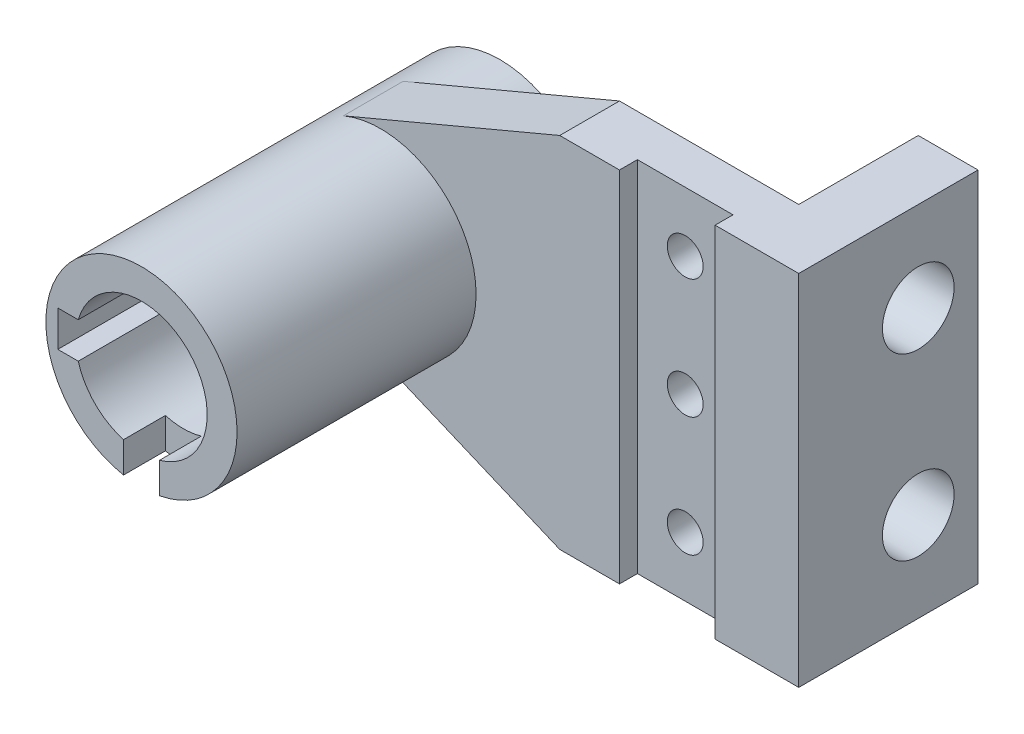
ISO-10303-21;
HEADER;
FILE_DESCRIPTION(('STEP AP214'),'2;1');
FILE_NAME('part.step','',(''),(''),'','','');
FILE_SCHEMA(('AUTOMOTIVE_DESIGN { 1 0 10303 214 1 1 1 1 }'));
ENDSEC;
DATA;
#1=APPLICATION_CONTEXT('core data for automotive mechanical design processes');
#2=APPLICATION_PROTOCOL_DEFINITION('international standard','automotive_design',2000,#1);
#3=PRODUCT_CONTEXT('',#1,'mechanical');
#4=PRODUCT('Part','Part','',(#3));
#5=PRODUCT_RELATED_PRODUCT_CATEGORY('part','',(#4));
#6=PRODUCT_DEFINITION_FORMATION('','',#4);
#7=PRODUCT_DEFINITION_CONTEXT('part definition',#1,'design');
#8=PRODUCT_DEFINITION('design','',#6,#7);
#9=PRODUCT_DEFINITION_SHAPE('','',#8);
#10=(LENGTH_UNIT() NAMED_UNIT(*) SI_UNIT(.MILLI.,.METRE.));
#11=(NAMED_UNIT(*) PLANE_ANGLE_UNIT() SI_UNIT($,.RADIAN.));
#12=(NAMED_UNIT(*) SI_UNIT($,.STERADIAN.) SOLID_ANGLE_UNIT());
#13=UNCERTAINTY_MEASURE_WITH_UNIT(LENGTH_MEASURE(1.E-05),#10,'distance_accuracy_value','');
#14=(GEOMETRIC_REPRESENTATION_CONTEXT(3) GLOBAL_UNCERTAINTY_ASSIGNED_CONTEXT((#13)) GLOBAL_UNIT_ASSIGNED_CONTEXT((#10,
#11,#12)) REPRESENTATION_CONTEXT('',''));
#15=CARTESIAN_POINT('',(0.,0.,0.));
#16=DIRECTION('',(0.,0.,1.));
#17=DIRECTION('',(1.,0.,0.));
#18=AXIS2_PLACEMENT_3D('',#15,#16,#17);
#19=CARTESIAN_POINT('',(0.,0.,-20.));
#20=DIRECTION('',(0.,0.,1.));
#21=DIRECTION('',(1.,0.,0.));
#22=AXIS2_PLACEMENT_3D('',#19,#20,#21);
#23=CYLINDRICAL_SURFACE('',#22,11.);
#24=DIRECTION('',(0.,0.,1.));
#25=VECTOR('',#24,1.);
#26=CARTESIAN_POINT('',(3.,-10.5830052442584,33.));
#27=LINE('',#26,#25);
#28=CARTESIAN_POINT('',(3.,-10.5830052442584,33.));
#29=VERTEX_POINT('',#28);
#30=CARTESIAN_POINT('',(3.,-10.5830052442584,40.));
#31=VERTEX_POINT('',#30);
#32=EDGE_CURVE('E193',#29,#31,#27,.T.);
#33=ORIENTED_EDGE('',*,*,#32,.T.);
#34=CARTESIAN_POINT('',(0.,0.,40.));
#35=DIRECTION('',(0.,0.,1.));
#36=DIRECTION('',(1.,0.,0.));
#37=AXIS2_PLACEMENT_3D('',#34,#35,#36);
#38=CIRCLE('',#37,11.);
#39=CARTESIAN_POINT('',(-10.5830052442584,3.,40.));
#40=VERTEX_POINT('',#39);
#41=EDGE_CURVE('E305',#31,#40,#38,.T.);
#42=ORIENTED_EDGE('',*,*,#41,.T.);
#43=DIRECTION('',(0.,0.,1.));
#44=VECTOR('',#43,1.);
#45=CARTESIAN_POINT('',(-10.5830052442584,3.,-20.));
#46=LINE('',#45,#44);
#47=CARTESIAN_POINT('',(-10.5830052442584,3.,-20.));
#48=VERTEX_POINT('',#47);
#49=EDGE_CURVE('E246',#48,#40,#46,.T.);
#50=ORIENTED_EDGE('',*,*,#49,.F.);
#51=CARTESIAN_POINT('',(0.,0.,-20.));
#52=DIRECTION('',(0.,0.,1.));
#53=DIRECTION('',(1.,0.,0.));
#54=AXIS2_PLACEMENT_3D('',#51,#52,#53);
#55=CIRCLE('',#54,11.);
#56=CARTESIAN_POINT('',(-10.5830052442584,-3.,-20.));
#57=VERTEX_POINT('',#56);
#58=EDGE_CURVE('E317',#57,#48,#55,.T.);
#59=ORIENTED_EDGE('',*,*,#58,.F.);
#60=DIRECTION('',(0.,0.,1.));
#61=VECTOR('',#60,1.);
#62=CARTESIAN_POINT('',(-10.5830052442584,-3.,-20.));
#63=LINE('',#62,#61);
#64=CARTESIAN_POINT('',(-10.5830052442584,-3.,40.));
#65=VERTEX_POINT('',#64);
#66=EDGE_CURVE('E326',#57,#65,#63,.T.);
#67=ORIENTED_EDGE('',*,*,#66,.T.);
#68=CARTESIAN_POINT('',(-3.,-10.5830052442584,40.));
#69=VERTEX_POINT('',#68);
#70=EDGE_CURVE('E306',#65,#69,#38,.T.);
#71=ORIENTED_EDGE('',*,*,#70,.T.);
#72=DIRECTION('',(0.,0.,1.));
#73=VECTOR('',#72,1.);
#74=CARTESIAN_POINT('',(-3.,-10.5830052442584,33.));
#75=LINE('',#74,#73);
#76=CARTESIAN_POINT('',(-3.,-10.5830052442584,33.));
#77=VERTEX_POINT('',#76);
#78=EDGE_CURVE('E58',#77,#69,#75,.T.);
#79=ORIENTED_EDGE('',*,*,#78,.F.);
#80=CARTESIAN_POINT('',(0.,0.,33.));
#81=DIRECTION('',(0.,0.,1.));
#82=DIRECTION('',(1.,0.,0.));
#83=AXIS2_PLACEMENT_3D('',#80,#81,#82);
#84=CIRCLE('',#83,11.);
#85=EDGE_CURVE('E209',#29,#77,#84,.F.);
#86=ORIENTED_EDGE('',*,*,#85,.F.);
#87=EDGE_LOOP('',(#33,#42,#50,#59,#67,#71,#79,#86));
#88=FACE_BOUND('',#87,.T.);
#89=ADVANCED_FACE('F41',(#88),#23,.F.);
#90=CARTESIAN_POINT('',(0.,0.,-20.));
#91=DIRECTION('',(0.,0.,1.));
#92=DIRECTION('',(1.,0.,0.));
#93=AXIS2_PLACEMENT_3D('',#90,#91,#92);
#94=CYLINDRICAL_SURFACE('',#93,16.);
#95=DIRECTION('',(0.,0.,1.));
#96=VECTOR('',#95,1.);
#97=CARTESIAN_POINT('',(-6.21167077567387,14.7450041090072,-10.));
#98=LINE('',#97,#96);
#99=CARTESIAN_POINT('',(-6.21167077567387,14.7450041090072,-10.));
#100=VERTEX_POINT('',#99);
#101=CARTESIAN_POINT('',(-6.21167077567387,14.7450041090072,0.));
#102=VERTEX_POINT('',#101);
#103=EDGE_CURVE('E274',#100,#102,#98,.T.);
#104=ORIENTED_EDGE('',*,*,#103,.F.);
#105=CARTESIAN_POINT('',(0.,0.,-10.));
#106=DIRECTION('',(0.,0.,1.));
#107=DIRECTION('',(1.,0.,0.));
#108=AXIS2_PLACEMENT_3D('',#105,#106,#107);
#109=CIRCLE('',#108,16.);
#110=CARTESIAN_POINT('',(-6.21167077567387,-14.7450041090072,-10.));
#111=VERTEX_POINT('',#110);
#112=EDGE_CURVE('E349',#111,#100,#109,.T.);
#113=ORIENTED_EDGE('',*,*,#112,.F.);
#114=DIRECTION('',(0.,0.,1.));
#115=VECTOR('',#114,1.);
#116=CARTESIAN_POINT('',(-6.21167077567387,-14.7450041090072,-10.));
#117=LINE('',#116,#115);
#118=CARTESIAN_POINT('',(-6.21167077567387,-14.7450041090072,0.));
#119=VERTEX_POINT('',#118);
#120=EDGE_CURVE('E45',#111,#119,#117,.T.);
#121=ORIENTED_EDGE('',*,*,#120,.T.);
#122=CARTESIAN_POINT('',(0.,0.,0.));
#123=DIRECTION('',(0.,0.,1.));
#124=DIRECTION('',(1.,0.,0.));
#125=AXIS2_PLACEMENT_3D('',#122,#123,#124);
#126=CIRCLE('',#125,16.);
#127=EDGE_CURVE('E347',#119,#102,#126,.T.);
#128=ORIENTED_EDGE('',*,*,#127,.T.);
#129=EDGE_LOOP('',(#104,#113,#121,#128));
#130=FACE_BOUND('',#129,.T.);
#131=CARTESIAN_POINT('',(0.,0.,-20.));
#132=DIRECTION('',(0.,0.,1.));
#133=DIRECTION('',(1.,0.,0.));
#134=AXIS2_PLACEMENT_3D('',#131,#132,#133);
#135=CIRCLE('',#134,16.);
#136=CARTESIAN_POINT('',(16.,0.,-20.));
#137=VERTEX_POINT('',#136);
#138=EDGE_CURVE('E323',#137,#137,#135,.T.);
#139=ORIENTED_EDGE('',*,*,#138,.T.);
#140=EDGE_LOOP('',(#139));
#141=FACE_BOUND('',#140,.T.);
#142=CARTESIAN_POINT('',(0.,0.,40.));
#143=DIRECTION('',(0.,0.,1.));
#144=DIRECTION('',(1.,0.,0.));
#145=AXIS2_PLACEMENT_3D('',#142,#143,#144);
#146=CIRCLE('',#145,16.);
#147=CARTESIAN_POINT('',(3.,-15.7162336455017,40.));
#148=VERTEX_POINT('',#147);
#149=CARTESIAN_POINT('',(-3.,-15.7162336455017,40.));
#150=VERTEX_POINT('',#149);
#151=EDGE_CURVE('E314',#148,#150,#146,.T.);
#152=ORIENTED_EDGE('',*,*,#151,.F.);
#153=DIRECTION('',(0.,0.,1.));
#154=VECTOR('',#153,1.);
#155=CARTESIAN_POINT('',(3.,-15.7162336455017,33.));
#156=LINE('',#155,#154);
#157=CARTESIAN_POINT('',(3.,-15.7162336455017,33.));
#158=VERTEX_POINT('',#157);
#159=EDGE_CURVE('E222',#158,#148,#156,.T.);
#160=ORIENTED_EDGE('',*,*,#159,.F.);
#161=CARTESIAN_POINT('',(0.,0.,33.));
#162=DIRECTION('',(0.,0.,1.));
#163=DIRECTION('',(1.,0.,0.));
#164=AXIS2_PLACEMENT_3D('',#161,#162,#163);
#165=CIRCLE('',#164,16.);
#166=CARTESIAN_POINT('',(-3.,-15.7162336455017,33.));
#167=VERTEX_POINT('',#166);
#168=EDGE_CURVE('E203',#167,#158,#165,.T.);
#169=ORIENTED_EDGE('',*,*,#168,.F.);
#170=DIRECTION('',(0.,0.,1.));
#171=VECTOR('',#170,1.);
#172=CARTESIAN_POINT('',(-3.,-15.7162336455017,33.));
#173=LINE('',#172,#171);
#174=EDGE_CURVE('E225',#167,#150,#173,.T.);
#175=ORIENTED_EDGE('',*,*,#174,.T.);
#176=EDGE_LOOP('',(#152,#160,#169,#175));
#177=FACE_BOUND('',#176,.T.);
#178=ADVANCED_FACE('F442',(#130,#141,#177),#94,.T.);
#179=CARTESIAN_POINT('',(0.,0.,40.));
#180=DIRECTION('',(0.,0.,1.));
#181=DIRECTION('',(1.,0.,0.));
#182=AXIS2_PLACEMENT_3D('',#179,#180,#181);
#183=PLANE('',#182);
#184=ORIENTED_EDGE('',*,*,#41,.F.);
#185=DIRECTION('',(0.,-1.,0.));
#186=VECTOR('',#185,1.);
#187=CARTESIAN_POINT('',(3.,0.,40.));
#188=LINE('',#187,#186);
#189=EDGE_CURVE('E199',#31,#148,#188,.T.);
#190=ORIENTED_EDGE('',*,*,#189,.T.);
#191=ORIENTED_EDGE('',*,*,#151,.T.);
#192=DIRECTION('',(0.,1.,0.));
#193=VECTOR('',#192,1.);
#194=CARTESIAN_POINT('',(-3.,0.,40.));
#195=LINE('',#194,#193);
#196=EDGE_CURVE('E212',#150,#69,#195,.T.);
#197=ORIENTED_EDGE('',*,*,#196,.T.);
#198=ORIENTED_EDGE('',*,*,#70,.F.);
#199=DIRECTION('',(1.,0.,0.));
#200=VECTOR('',#199,1.);
#201=CARTESIAN_POINT('',(0.,-3.,40.));
#202=LINE('',#201,#200);
#203=CARTESIAN_POINT('',(-14.,-3.,40.));
#204=VERTEX_POINT('',#203);
#205=EDGE_CURVE('E308',#204,#65,#202,.T.);
#206=ORIENTED_EDGE('',*,*,#205,.F.);
#207=DIRECTION('',(0.,-1.,0.));
#208=VECTOR('',#207,1.);
#209=CARTESIAN_POINT('',(-14.,0.,40.));
#210=LINE('',#209,#208);
#211=CARTESIAN_POINT('',(-14.,3.,40.));
#212=VERTEX_POINT('',#211);
#213=EDGE_CURVE('E311',#212,#204,#210,.T.);
#214=ORIENTED_EDGE('',*,*,#213,.F.);
#215=DIRECTION('',(1.,0.,0.));
#216=VECTOR('',#215,1.);
#217=CARTESIAN_POINT('',(0.,3.,40.));
#218=LINE('',#217,#216);
#219=EDGE_CURVE('E240',#212,#40,#218,.T.);
#220=ORIENTED_EDGE('',*,*,#219,.T.);
#221=EDGE_LOOP('',(#184,#190,#191,#197,#198,#206,#214,#220));
#222=FACE_BOUND('',#221,.T.);
#223=ADVANCED_FACE('F447',(#222),#183,.T.);
#224=CARTESIAN_POINT('',(0.,0.,-10.));
#225=DIRECTION('',(0.,0.,1.));
#226=DIRECTION('',(1.,0.,0.));
#227=AXIS2_PLACEMENT_3D('',#224,#225,#226);
#228=PLANE('',#227);
#229=ORIENTED_EDGE('',*,*,#112,.T.);
#230=DIRECTION('',(0.92156275681295,0.388229423479617,0.));
#231=VECTOR('',#230,1.);
#232=CARTESIAN_POINT('',(-6.21167077567387,14.7450041090072,-10.));
#233=LINE('',#232,#231);
#234=CARTESIAN_POINT('',(30.,30.,-10.));
#235=VERTEX_POINT('',#234);
#236=EDGE_CURVE('E264',#100,#235,#233,.T.);
#237=ORIENTED_EDGE('',*,*,#236,.T.);
#238=DIRECTION('',(1.,0.,0.));
#239=VECTOR('',#238,1.);
#240=CARTESIAN_POINT('',(0.,30.,-10.));
#241=LINE('',#240,#239);
#242=CARTESIAN_POINT('',(60.,30.,-10.));
#243=VERTEX_POINT('',#242);
#244=EDGE_CURVE('E267',#235,#243,#241,.T.);
#245=ORIENTED_EDGE('',*,*,#244,.T.);
#246=DIRECTION('',(0.,1.,0.));
#247=VECTOR('',#246,1.);
#248=CARTESIAN_POINT('',(60.,0.,-10.));
#249=LINE('',#248,#247);
#250=CARTESIAN_POINT('',(60.,-30.,-10.));
#251=VERTEX_POINT('',#250);
#252=EDGE_CURVE('E294',#251,#243,#249,.T.);
#253=ORIENTED_EDGE('',*,*,#252,.F.);
#254=DIRECTION('',(1.,0.,0.));
#255=VECTOR('',#254,1.);
#256=CARTESIAN_POINT('',(0.,-30.,-10.));
#257=LINE('',#256,#255);
#258=CARTESIAN_POINT('',(30.,-30.,-10.));
#259=VERTEX_POINT('',#258);
#260=EDGE_CURVE('E354',#259,#251,#257,.T.);
#261=ORIENTED_EDGE('',*,*,#260,.F.);
#262=DIRECTION('',(0.92156275681295,-0.388229423479617,0.));
#263=VECTOR('',#262,1.);
#264=CARTESIAN_POINT('',(-6.21167077567387,-14.7450041090072,-10.));
#265=LINE('',#264,#263);
#266=EDGE_CURVE('E351',#111,#259,#265,.T.);
#267=ORIENTED_EDGE('',*,*,#266,.F.);
#268=EDGE_LOOP('',(#229,#237,#245,#253,#261,#267));
#269=FACE_BOUND('',#268,.T.);
#270=CARTESIAN_POINT('',(48.,-20.,-10.));
#271=DIRECTION('',(0.,0.,1.));
#272=DIRECTION('',(1.,0.,0.));
#273=AXIS2_PLACEMENT_3D('',#270,#271,#272);
#274=CIRCLE('',#273,3.);
#275=CARTESIAN_POINT('',(51.,-20.,-10.));
#276=VERTEX_POINT('',#275);
#277=EDGE_CURVE('E359',#276,#276,#274,.T.);
#278=ORIENTED_EDGE('',*,*,#277,.T.);
#279=EDGE_LOOP('',(#278));
#280=FACE_BOUND('',#279,.T.);
#281=CARTESIAN_POINT('',(48.,0.,-10.));
#282=DIRECTION('',(0.,0.,1.));
#283=DIRECTION('',(1.,0.,0.));
#284=AXIS2_PLACEMENT_3D('',#281,#282,#283);
#285=CIRCLE('',#284,3.);
#286=CARTESIAN_POINT('',(51.,0.,-10.));
#287=VERTEX_POINT('',#286);
#288=EDGE_CURVE('E356',#287,#287,#285,.T.);
#289=ORIENTED_EDGE('',*,*,#288,.T.);
#290=EDGE_LOOP('',(#289));
#291=FACE_BOUND('',#290,.T.);
#292=CARTESIAN_POINT('',(48.,20.,-10.));
#293=DIRECTION('',(0.,0.,-1.));
#294=DIRECTION('',(1.,0.,0.));
#295=AXIS2_PLACEMENT_3D('',#292,#293,#294);
#296=CIRCLE('',#295,3.);
#297=CARTESIAN_POINT('',(51.,20.,-10.));
#298=VERTEX_POINT('',#297);
#299=EDGE_CURVE('E271',#298,#298,#296,.T.);
#300=ORIENTED_EDGE('',*,*,#299,.F.);
#301=EDGE_LOOP('',(#300));
#302=FACE_BOUND('',#301,.T.);
#303=ADVANCED_FACE('F393',(#269,#280,#291,#302),#228,.F.);
#304=CARTESIAN_POINT('',(48.,0.,-10.));
#305=DIRECTION('',(0.,0.,1.));
#306=DIRECTION('',(1.,0.,0.));
#307=AXIS2_PLACEMENT_3D('',#304,#305,#306);
#308=CYLINDRICAL_SURFACE('',#307,3.);
#309=CARTESIAN_POINT('',(48.,0.,-3.));
#310=DIRECTION('',(0.,0.,1.));
#311=DIRECTION('',(1.,0.,0.));
#312=AXIS2_PLACEMENT_3D('',#309,#310,#311);
#313=CIRCLE('',#312,3.);
#314=CARTESIAN_POINT('',(51.,0.,-3.));
#315=VERTEX_POINT('',#314);
#316=EDGE_CURVE('E333',#315,#315,#313,.T.);
#317=ORIENTED_EDGE('',*,*,#316,.T.);
#318=EDGE_LOOP('',(#317));
#319=FACE_BOUND('',#318,.T.);
#320=ORIENTED_EDGE('',*,*,#288,.F.);
#321=EDGE_LOOP('',(#320));
#322=FACE_BOUND('',#321,.T.);
#323=ADVANCED_FACE('F461',(#319,#322),#308,.F.);
#324=CARTESIAN_POINT('',(48.,-20.,-10.));
#325=DIRECTION('',(0.,0.,1.));
#326=DIRECTION('',(1.,0.,0.));
#327=AXIS2_PLACEMENT_3D('',#324,#325,#326);
#328=CYLINDRICAL_SURFACE('',#327,3.);
#329=ORIENTED_EDGE('',*,*,#277,.F.);
#330=EDGE_LOOP('',(#329));
#331=FACE_BOUND('',#330,.T.);
#332=CARTESIAN_POINT('',(48.,-20.,-3.));
#333=DIRECTION('',(0.,0.,1.));
#334=DIRECTION('',(1.,0.,0.));
#335=AXIS2_PLACEMENT_3D('',#332,#333,#334);
#336=CIRCLE('',#335,3.);
#337=CARTESIAN_POINT('',(51.,-20.,-3.));
#338=VERTEX_POINT('',#337);
#339=EDGE_CURVE('E330',#338,#338,#336,.T.);
#340=ORIENTED_EDGE('',*,*,#339,.T.);
#341=EDGE_LOOP('',(#340));
#342=FACE_BOUND('',#341,.T.);
#343=ADVANCED_FACE('F438',(#331,#342),#328,.F.);
#344=CARTESIAN_POINT('',(0.,0.,0.));
#345=DIRECTION('',(0.,0.,1.));
#346=DIRECTION('',(1.,0.,0.));
#347=AXIS2_PLACEMENT_3D('',#344,#345,#346);
#348=PLANE('',#347);
#349=DIRECTION('',(1.,0.,0.));
#350=VECTOR('',#349,1.);
#351=CARTESIAN_POINT('',(0.,-30.,0.));
#352=LINE('',#351,#350);
#353=CARTESIAN_POINT('',(30.,-30.,0.));
#354=VERTEX_POINT('',#353);
#355=CARTESIAN_POINT('',(40.,-30.,0.));
#356=VERTEX_POINT('',#355);
#357=EDGE_CURVE('E367',#354,#356,#352,.T.);
#358=ORIENTED_EDGE('',*,*,#357,.T.);
#359=DIRECTION('',(0.,1.,0.));
#360=VECTOR('',#359,1.);
#361=CARTESIAN_POINT('',(40.,0.,0.));
#362=LINE('',#361,#360);
#363=CARTESIAN_POINT('',(40.,30.,0.));
#364=VERTEX_POINT('',#363);
#365=EDGE_CURVE('E96',#356,#364,#362,.T.);
#366=ORIENTED_EDGE('',*,*,#365,.T.);
#367=DIRECTION('',(1.,0.,0.));
#368=VECTOR('',#367,1.);
#369=CARTESIAN_POINT('',(0.,30.,0.));
#370=LINE('',#369,#368);
#371=CARTESIAN_POINT('',(30.,30.,0.));
#372=VERTEX_POINT('',#371);
#373=EDGE_CURVE('E268',#372,#364,#370,.T.);
#374=ORIENTED_EDGE('',*,*,#373,.F.);
#375=DIRECTION('',(0.92156275681295,0.388229423479617,0.));
#376=VECTOR('',#375,1.);
#377=CARTESIAN_POINT('',(-6.21167077567387,14.7450041090072,0.));
#378=LINE('',#377,#376);
#379=EDGE_CURVE('E262',#102,#372,#378,.T.);
#380=ORIENTED_EDGE('',*,*,#379,.F.);
#381=ORIENTED_EDGE('',*,*,#127,.F.);
#382=DIRECTION('',(0.92156275681295,-0.388229423479617,0.));
#383=VECTOR('',#382,1.);
#384=CARTESIAN_POINT('',(-6.21167077567387,-14.7450041090072,0.));
#385=LINE('',#384,#383);
#386=EDGE_CURVE('E363',#119,#354,#385,.T.);
#387=ORIENTED_EDGE('',*,*,#386,.T.);
#388=EDGE_LOOP('',(#358,#366,#374,#380,#381,#387));
#389=FACE_BOUND('',#388,.T.);
#390=ADVANCED_FACE('F404',(#389),#348,.T.);
#391=CARTESIAN_POINT('',(70.,0.,-10.));
#392=DIRECTION('',(1.,0.,0.));
#393=DIRECTION('',(0.,0.,-1.));
#394=AXIS2_PLACEMENT_3D('',#391,#392,#393);
#395=PLANE('',#394);
#396=DIRECTION('',(0.,1.,0.));
#397=VECTOR('',#396,1.);
#398=CARTESIAN_POINT('',(70.,0.,0.));
#399=LINE('',#398,#397);
#400=CARTESIAN_POINT('',(70.,-30.,0.));
#401=VERTEX_POINT('',#400);
#402=CARTESIAN_POINT('',(70.,30.,0.));
#403=VERTEX_POINT('',#402);
#404=EDGE_CURVE('E352',#401,#403,#399,.T.);
#405=ORIENTED_EDGE('',*,*,#404,.F.);
#406=DIRECTION('',(0.,0.,1.));
#407=VECTOR('',#406,1.);
#408=CARTESIAN_POINT('',(70.,-30.,-10.));
#409=LINE('',#408,#407);
#410=CARTESIAN_POINT('',(70.,-30.,-30.));
#411=VERTEX_POINT('',#410);
#412=EDGE_CURVE('E11',#411,#401,#409,.T.);
#413=ORIENTED_EDGE('',*,*,#412,.F.);
#414=DIRECTION('',(0.,1.,0.));
#415=VECTOR('',#414,1.);
#416=CARTESIAN_POINT('',(70.,0.,-30.));
#417=LINE('',#416,#415);
#418=CARTESIAN_POINT('',(70.,30.,-30.));
#419=VERTEX_POINT('',#418);
#420=EDGE_CURVE('E292',#411,#419,#417,.T.);
#421=ORIENTED_EDGE('',*,*,#420,.T.);
#422=DIRECTION('',(0.,0.,1.));
#423=VECTOR('',#422,1.);
#424=CARTESIAN_POINT('',(70.,30.,-10.));
#425=LINE('',#424,#423);
#426=EDGE_CURVE('E280',#419,#403,#425,.T.);
#427=ORIENTED_EDGE('',*,*,#426,.T.);
#428=EDGE_LOOP('',(#405,#413,#421,#427));
#429=FACE_BOUND('',#428,.T.);
#430=CARTESIAN_POINT('',(70.,-15.,-20.));
#431=DIRECTION('',(1.,0.,0.));
#432=DIRECTION('',(0.,0.,-1.));
#433=AXIS2_PLACEMENT_3D('',#430,#431,#432);
#434=CIRCLE('',#433,6.);
#435=CARTESIAN_POINT('',(70.,-15.,-26.));
#436=VERTEX_POINT('',#435);
#437=EDGE_CURVE('E283',#436,#436,#434,.T.);
#438=ORIENTED_EDGE('',*,*,#437,.F.);
#439=EDGE_LOOP('',(#438));
#440=FACE_BOUND('',#439,.T.);
#441=CARTESIAN_POINT('',(70.,15.,-20.));
#442=DIRECTION('',(-1.,0.,0.));
#443=DIRECTION('',(0.,0.,-1.));
#444=AXIS2_PLACEMENT_3D('',#441,#442,#443);
#445=CIRCLE('',#444,6.);
#446=CARTESIAN_POINT('',(70.,15.,-26.));
#447=VERTEX_POINT('',#446);
#448=EDGE_CURVE('E224',#447,#447,#445,.T.);
#449=ORIENTED_EDGE('',*,*,#448,.T.);
#450=EDGE_LOOP('',(#449));
#451=FACE_BOUND('',#450,.T.);
#452=ADVANCED_FACE('F382',(#429,#440,#451),#395,.T.);
#453=CARTESIAN_POINT('',(0.,-30.,-10.));
#454=DIRECTION('',(0.,-1.,0.));
#455=DIRECTION('',(1.,0.,0.));
#456=AXIS2_PLACEMENT_3D('',#453,#454,#455);
#457=PLANE('',#456);
#458=DIRECTION('',(0.,0.,1.));
#459=VECTOR('',#458,1.);
#460=CARTESIAN_POINT('',(56.,-30.,-3.));
#461=LINE('',#460,#459);
#462=CARTESIAN_POINT('',(56.,-30.,-3.));
#463=VERTEX_POINT('',#462);
#464=CARTESIAN_POINT('',(56.,-30.,0.));
#465=VERTEX_POINT('',#464);
#466=EDGE_CURVE('E345',#463,#465,#461,.T.);
#467=ORIENTED_EDGE('',*,*,#466,.F.);
#468=DIRECTION('',(1.,0.,0.));
#469=VECTOR('',#468,1.);
#470=CARTESIAN_POINT('',(0.,-30.,-3.));
#471=LINE('',#470,#469);
#472=CARTESIAN_POINT('',(40.,-30.,-3.));
#473=VERTEX_POINT('',#472);
#474=EDGE_CURVE('E339',#473,#463,#471,.T.);
#475=ORIENTED_EDGE('',*,*,#474,.F.);
#476=DIRECTION('',(0.,0.,1.));
#477=VECTOR('',#476,1.);
#478=CARTESIAN_POINT('',(40.,-30.,-3.));
#479=LINE('',#478,#477);
#480=EDGE_CURVE('E342',#473,#356,#479,.T.);
#481=ORIENTED_EDGE('',*,*,#480,.T.);
#482=ORIENTED_EDGE('',*,*,#357,.F.);
#483=DIRECTION('',(0.,0.,1.));
#484=VECTOR('',#483,1.);
#485=CARTESIAN_POINT('',(30.,-30.,-10.));
#486=LINE('',#485,#484);
#487=EDGE_CURVE('E50',#259,#354,#486,.T.);
#488=ORIENTED_EDGE('',*,*,#487,.F.);
#489=ORIENTED_EDGE('',*,*,#260,.T.);
#490=DIRECTION('',(0.,0.,-1.));
#491=VECTOR('',#490,1.);
#492=CARTESIAN_POINT('',(60.,-30.,0.));
#493=LINE('',#492,#491);
#494=CARTESIAN_POINT('',(60.,-30.,-30.));
#495=VERTEX_POINT('',#494);
#496=EDGE_CURVE('E296',#251,#495,#493,.T.);
#497=ORIENTED_EDGE('',*,*,#496,.T.);
#498=DIRECTION('',(1.,0.,0.));
#499=VECTOR('',#498,1.);
#500=CARTESIAN_POINT('',(60.,-30.,-30.));
#501=LINE('',#500,#499);
#502=EDGE_CURVE('E299',#495,#411,#501,.T.);
#503=ORIENTED_EDGE('',*,*,#502,.T.);
#504=ORIENTED_EDGE('',*,*,#412,.T.);
#505=EDGE_CURVE('E366',#465,#401,#352,.T.);
#506=ORIENTED_EDGE('',*,*,#505,.F.);
#507=EDGE_LOOP('',(#467,#475,#481,#482,#488,#489,#497,#503,#504,#506));
#508=FACE_BOUND('',#507,.T.);
#509=ADVANCED_FACE('F414',(#508),#457,.T.);
#510=CARTESIAN_POINT('',(-6.21167077567387,-14.7450041090072,-10.));
#511=DIRECTION('',(-0.388229423479617,-0.92156275681295,0.));
#512=DIRECTION('',(0.92156275681295,-0.388229423479617,0.));
#513=AXIS2_PLACEMENT_3D('',#510,#511,#512);
#514=PLANE('',#513);
#515=ORIENTED_EDGE('',*,*,#386,.F.);
#516=ORIENTED_EDGE('',*,*,#120,.F.);
#517=ORIENTED_EDGE('',*,*,#266,.T.);
#518=ORIENTED_EDGE('',*,*,#487,.T.);
#519=EDGE_LOOP('',(#515,#516,#517,#518));
#520=FACE_BOUND('',#519,.T.);
#521=ADVANCED_FACE('F43',(#520),#514,.T.);
#522=DIRECTION('',(0.,1.,0.));
#523=VECTOR('',#522,1.);
#524=CARTESIAN_POINT('',(56.,0.,0.));
#525=LINE('',#524,#523);
#526=CARTESIAN_POINT('',(56.,30.,0.));
#527=VERTEX_POINT('',#526);
#528=EDGE_CURVE('E334',#465,#527,#525,.T.);
#529=ORIENTED_EDGE('',*,*,#528,.F.);
#530=ORIENTED_EDGE('',*,*,#505,.T.);
#531=ORIENTED_EDGE('',*,*,#404,.T.);
#532=EDGE_CURVE('E277',#527,#403,#370,.T.);
#533=ORIENTED_EDGE('',*,*,#532,.F.);
#534=EDGE_LOOP('',(#529,#530,#531,#533));
#535=FACE_BOUND('',#534,.T.);
#536=ADVANCED_FACE('F375',(#535),#348,.T.);
#537=CARTESIAN_POINT('',(56.,0.,-3.));
#538=DIRECTION('',(1.,0.,0.));
#539=DIRECTION('',(0.,0.,-1.));
#540=AXIS2_PLACEMENT_3D('',#537,#538,#539);
#541=PLANE('',#540);
#542=ORIENTED_EDGE('',*,*,#528,.T.);
#543=DIRECTION('',(0.,0.,1.));
#544=VECTOR('',#543,1.);
#545=CARTESIAN_POINT('',(56.,30.,-3.));
#546=LINE('',#545,#544);
#547=CARTESIAN_POINT('',(56.,30.,-3.));
#548=VERTEX_POINT('',#547);
#549=EDGE_CURVE('E259',#548,#527,#546,.T.);
#550=ORIENTED_EDGE('',*,*,#549,.F.);
#551=DIRECTION('',(0.,1.,0.));
#552=VECTOR('',#551,1.);
#553=CARTESIAN_POINT('',(56.,0.,-3.));
#554=LINE('',#553,#552);
#555=EDGE_CURVE('E85',#463,#548,#554,.T.);
#556=ORIENTED_EDGE('',*,*,#555,.F.);
#557=ORIENTED_EDGE('',*,*,#466,.T.);
#558=EDGE_LOOP('',(#542,#550,#556,#557));
#559=FACE_BOUND('',#558,.T.);
#560=ADVANCED_FACE('F412',(#559),#541,.F.);
#561=CARTESIAN_POINT('',(40.,0.,-3.));
#562=DIRECTION('',(1.,0.,0.));
#563=DIRECTION('',(0.,0.,-1.));
#564=AXIS2_PLACEMENT_3D('',#561,#562,#563);
#565=PLANE('',#564);
#566=ORIENTED_EDGE('',*,*,#365,.F.);
#567=ORIENTED_EDGE('',*,*,#480,.F.);
#568=DIRECTION('',(0.,1.,0.));
#569=VECTOR('',#568,1.);
#570=CARTESIAN_POINT('',(40.,0.,-3.));
#571=LINE('',#570,#569);
#572=CARTESIAN_POINT('',(40.,30.,-3.));
#573=VERTEX_POINT('',#572);
#574=EDGE_CURVE('E337',#473,#573,#571,.T.);
#575=ORIENTED_EDGE('',*,*,#574,.T.);
#576=DIRECTION('',(0.,0.,1.));
#577=VECTOR('',#576,1.);
#578=CARTESIAN_POINT('',(40.,30.,-3.));
#579=LINE('',#578,#577);
#580=EDGE_CURVE('E258',#573,#364,#579,.T.);
#581=ORIENTED_EDGE('',*,*,#580,.T.);
#582=EDGE_LOOP('',(#566,#567,#575,#581));
#583=FACE_BOUND('',#582,.T.);
#584=ADVANCED_FACE('F405',(#583),#565,.T.);
#585=CARTESIAN_POINT('',(0.,0.,-3.));
#586=DIRECTION('',(0.,0.,1.));
#587=DIRECTION('',(1.,0.,0.));
#588=AXIS2_PLACEMENT_3D('',#585,#586,#587);
#589=PLANE('',#588);
#590=DIRECTION('',(1.,0.,0.));
#591=VECTOR('',#590,1.);
#592=CARTESIAN_POINT('',(0.,30.,-3.));
#593=LINE('',#592,#591);
#594=EDGE_CURVE('E255',#573,#548,#593,.T.);
#595=ORIENTED_EDGE('',*,*,#594,.F.);
#596=ORIENTED_EDGE('',*,*,#574,.F.);
#597=ORIENTED_EDGE('',*,*,#474,.T.);
#598=ORIENTED_EDGE('',*,*,#555,.T.);
#599=EDGE_LOOP('',(#595,#596,#597,#598));
#600=FACE_BOUND('',#599,.T.);
#601=ORIENTED_EDGE('',*,*,#339,.F.);
#602=EDGE_LOOP('',(#601));
#603=FACE_BOUND('',#602,.T.);
#604=ORIENTED_EDGE('',*,*,#316,.F.);
#605=EDGE_LOOP('',(#604));
#606=FACE_BOUND('',#605,.T.);
#607=CARTESIAN_POINT('',(48.,20.,-3.));
#608=DIRECTION('',(0.,0.,-1.));
#609=DIRECTION('',(1.,0.,0.));
#610=AXIS2_PLACEMENT_3D('',#607,#608,#609);
#611=CIRCLE('',#610,3.);
#612=CARTESIAN_POINT('',(51.,20.,-3.));
#613=VERTEX_POINT('',#612);
#614=EDGE_CURVE('E250',#613,#613,#611,.T.);
#615=ORIENTED_EDGE('',*,*,#614,.T.);
#616=EDGE_LOOP('',(#615));
#617=FACE_BOUND('',#616,.T.);
#618=ADVANCED_FACE('F410',(#600,#603,#606,#617),#589,.T.);
#619=CARTESIAN_POINT('',(-14.,0.,-20.));
#620=DIRECTION('',(-1.,0.,0.));
#621=DIRECTION('',(0.,0.,1.));
#622=AXIS2_PLACEMENT_3D('',#619,#620,#621);
#623=PLANE('',#622);
#624=DIRECTION('',(0.,-1.,0.));
#625=VECTOR('',#624,1.);
#626=CARTESIAN_POINT('',(-14.,0.,-20.));
#627=LINE('',#626,#625);
#628=CARTESIAN_POINT('',(-14.,3.,-20.));
#629=VERTEX_POINT('',#628);
#630=CARTESIAN_POINT('',(-14.,-3.,-20.));
#631=VERTEX_POINT('',#630);
#632=EDGE_CURVE('E321',#629,#631,#627,.T.);
#633=ORIENTED_EDGE('',*,*,#632,.F.);
#634=DIRECTION('',(0.,0.,1.));
#635=VECTOR('',#634,1.);
#636=CARTESIAN_POINT('',(-14.,3.,-20.));
#637=LINE('',#636,#635);
#638=EDGE_CURVE('E247',#629,#212,#637,.T.);
#639=ORIENTED_EDGE('',*,*,#638,.T.);
#640=ORIENTED_EDGE('',*,*,#213,.T.);
#641=DIRECTION('',(0.,0.,1.));
#642=VECTOR('',#641,1.);
#643=CARTESIAN_POINT('',(-14.,-3.,-20.));
#644=LINE('',#643,#642);
#645=EDGE_CURVE('E327',#631,#204,#644,.T.);
#646=ORIENTED_EDGE('',*,*,#645,.F.);
#647=EDGE_LOOP('',(#633,#639,#640,#646));
#648=FACE_BOUND('',#647,.T.);
#649=ADVANCED_FACE('F455',(#648),#623,.F.);
#650=CARTESIAN_POINT('',(0.,-3.,-20.));
#651=DIRECTION('',(0.,-1.,0.));
#652=DIRECTION('',(1.,0.,0.));
#653=AXIS2_PLACEMENT_3D('',#650,#651,#652);
#654=PLANE('',#653);
#655=ORIENTED_EDGE('',*,*,#645,.T.);
#656=ORIENTED_EDGE('',*,*,#205,.T.);
#657=ORIENTED_EDGE('',*,*,#66,.F.);
#658=DIRECTION('',(1.,0.,0.));
#659=VECTOR('',#658,1.);
#660=CARTESIAN_POINT('',(0.,-3.,-20.));
#661=LINE('',#660,#659);
#662=EDGE_CURVE('E319',#631,#57,#661,.T.);
#663=ORIENTED_EDGE('',*,*,#662,.F.);
#664=EDGE_LOOP('',(#655,#656,#657,#663));
#665=FACE_BOUND('',#664,.T.);
#666=ADVANCED_FACE('F451',(#665),#654,.F.);
#667=CARTESIAN_POINT('',(0.,0.,-20.));
#668=DIRECTION('',(0.,0.,1.));
#669=DIRECTION('',(1.,0.,0.));
#670=AXIS2_PLACEMENT_3D('',#667,#668,#669);
#671=PLANE('',#670);
#672=ORIENTED_EDGE('',*,*,#58,.T.);
#673=DIRECTION('',(1.,0.,0.));
#674=VECTOR('',#673,1.);
#675=CARTESIAN_POINT('',(0.,3.,-20.));
#676=LINE('',#675,#674);
#677=EDGE_CURVE('E243',#629,#48,#676,.T.);
#678=ORIENTED_EDGE('',*,*,#677,.F.);
#679=ORIENTED_EDGE('',*,*,#632,.T.);
#680=ORIENTED_EDGE('',*,*,#662,.T.);
#681=EDGE_LOOP('',(#672,#678,#679,#680));
#682=FACE_BOUND('',#681,.T.);
#683=ORIENTED_EDGE('',*,*,#138,.F.);
#684=EDGE_LOOP('',(#683));
#685=FACE_BOUND('',#684,.T.);
#686=ADVANCED_FACE('F491',(#682,#685),#671,.F.);
#687=CARTESIAN_POINT('',(60.,0.,-30.));
#688=DIRECTION('',(0.,0.,-1.));
#689=DIRECTION('',(-1.,0.,0.));
#690=AXIS2_PLACEMENT_3D('',#687,#688,#689);
#691=PLANE('',#690);
#692=ORIENTED_EDGE('',*,*,#420,.F.);
#693=ORIENTED_EDGE('',*,*,#502,.F.);
#694=DIRECTION('',(0.,1.,0.));
#695=VECTOR('',#694,1.);
#696=CARTESIAN_POINT('',(60.,0.,-30.));
#697=LINE('',#696,#695);
#698=CARTESIAN_POINT('',(60.,30.,-30.));
#699=VERTEX_POINT('',#698);
#700=EDGE_CURVE('E291',#495,#699,#697,.T.);
#701=ORIENTED_EDGE('',*,*,#700,.T.);
#702=DIRECTION('',(1.,0.,0.));
#703=VECTOR('',#702,1.);
#704=CARTESIAN_POINT('',(60.,30.,-30.));
#705=LINE('',#704,#703);
#706=EDGE_CURVE('E235',#699,#419,#705,.T.);
#707=ORIENTED_EDGE('',*,*,#706,.T.);
#708=EDGE_LOOP('',(#692,#693,#701,#707));
#709=FACE_BOUND('',#708,.T.);
#710=ADVANCED_FACE('F386',(#709),#691,.T.);
#711=CARTESIAN_POINT('',(60.,-15.,-20.));
#712=DIRECTION('',(1.,0.,0.));
#713=DIRECTION('',(0.,0.,-1.));
#714=AXIS2_PLACEMENT_3D('',#711,#712,#713);
#715=CYLINDRICAL_SURFACE('',#714,6.);
#716=CARTESIAN_POINT('',(60.,-15.,-20.));
#717=DIRECTION('',(1.,0.,0.));
#718=DIRECTION('',(0.,0.,-1.));
#719=AXIS2_PLACEMENT_3D('',#716,#717,#718);
#720=CIRCLE('',#719,6.);
#721=CARTESIAN_POINT('',(60.,-15.,-26.));
#722=VERTEX_POINT('',#721);
#723=EDGE_CURVE('E288',#722,#722,#720,.T.);
#724=ORIENTED_EDGE('',*,*,#723,.F.);
#725=EDGE_LOOP('',(#724));
#726=FACE_BOUND('',#725,.T.);
#727=ORIENTED_EDGE('',*,*,#437,.T.);
#728=EDGE_LOOP('',(#727));
#729=FACE_BOUND('',#728,.T.);
#730=ADVANCED_FACE('F419',(#726,#729),#715,.F.);
#731=CARTESIAN_POINT('',(60.,0.,0.));
#732=DIRECTION('',(1.,0.,0.));
#733=DIRECTION('',(0.,0.,-1.));
#734=AXIS2_PLACEMENT_3D('',#731,#732,#733);
#735=PLANE('',#734);
#736=ORIENTED_EDGE('',*,*,#723,.T.);
#737=EDGE_LOOP('',(#736));
#738=FACE_BOUND('',#737,.T.);
#739=ORIENTED_EDGE('',*,*,#700,.F.);
#740=ORIENTED_EDGE('',*,*,#496,.F.);
#741=ORIENTED_EDGE('',*,*,#252,.T.);
#742=DIRECTION('',(0.,0.,-1.));
#743=VECTOR('',#742,1.);
#744=CARTESIAN_POINT('',(60.,30.,0.));
#745=LINE('',#744,#743);
#746=EDGE_CURVE('E232',#243,#699,#745,.T.);
#747=ORIENTED_EDGE('',*,*,#746,.T.);
#748=EDGE_LOOP('',(#739,#740,#741,#747));
#749=FACE_BOUND('',#748,.T.);
#750=CARTESIAN_POINT('',(60.,15.,-20.));
#751=DIRECTION('',(-1.,0.,0.));
#752=DIRECTION('',(0.,0.,-1.));
#753=AXIS2_PLACEMENT_3D('',#750,#751,#752);
#754=CIRCLE('',#753,6.);
#755=CARTESIAN_POINT('',(60.,15.,-26.));
#756=VERTEX_POINT('',#755);
#757=EDGE_CURVE('E229',#756,#756,#754,.T.);
#758=ORIENTED_EDGE('',*,*,#757,.F.);
#759=EDGE_LOOP('',(#758));
#760=FACE_BOUND('',#759,.T.);
#761=ADVANCED_FACE('F415',(#738,#749,#760),#735,.F.);
#762=CARTESIAN_POINT('',(48.,20.,-10.));
#763=DIRECTION('',(0.,0.,1.));
#764=DIRECTION('',(1.,0.,0.));
#765=AXIS2_PLACEMENT_3D('',#762,#763,#764);
#766=CYLINDRICAL_SURFACE('',#765,3.);
#767=ORIENTED_EDGE('',*,*,#299,.T.);
#768=EDGE_LOOP('',(#767));
#769=FACE_BOUND('',#768,.T.);
#770=ORIENTED_EDGE('',*,*,#614,.F.);
#771=EDGE_LOOP('',(#770));
#772=FACE_BOUND('',#771,.T.);
#773=ADVANCED_FACE('F418',(#769,#772),#766,.F.);
#774=CARTESIAN_POINT('',(0.,30.,-10.));
#775=DIRECTION('',(0.,1.,0.));
#776=DIRECTION('',(1.,0.,0.));
#777=AXIS2_PLACEMENT_3D('',#774,#775,#776);
#778=PLANE('',#777);
#779=ORIENTED_EDGE('',*,*,#549,.T.);
#780=ORIENTED_EDGE('',*,*,#532,.T.);
#781=ORIENTED_EDGE('',*,*,#426,.F.);
#782=ORIENTED_EDGE('',*,*,#706,.F.);
#783=ORIENTED_EDGE('',*,*,#746,.F.);
#784=ORIENTED_EDGE('',*,*,#244,.F.);
#785=DIRECTION('',(0.,0.,1.));
#786=VECTOR('',#785,1.);
#787=CARTESIAN_POINT('',(30.,30.,-10.));
#788=LINE('',#787,#786);
#789=EDGE_CURVE('E284',#235,#372,#788,.T.);
#790=ORIENTED_EDGE('',*,*,#789,.T.);
#791=ORIENTED_EDGE('',*,*,#373,.T.);
#792=ORIENTED_EDGE('',*,*,#580,.F.);
#793=ORIENTED_EDGE('',*,*,#594,.T.);
#794=EDGE_LOOP('',(#779,#780,#781,#782,#783,#784,#790,#791,#792,#793));
#795=FACE_BOUND('',#794,.T.);
#796=ADVANCED_FACE('F380',(#795),#778,.T.);
#797=CARTESIAN_POINT('',(-6.21167077567387,14.7450041090072,-10.));
#798=DIRECTION('',(-0.388229423479617,0.92156275681295,0.));
#799=DIRECTION('',(0.92156275681295,0.388229423479617,0.));
#800=AXIS2_PLACEMENT_3D('',#797,#798,#799);
#801=PLANE('',#800);
#802=ORIENTED_EDGE('',*,*,#379,.T.);
#803=ORIENTED_EDGE('',*,*,#789,.F.);
#804=ORIENTED_EDGE('',*,*,#236,.F.);
#805=ORIENTED_EDGE('',*,*,#103,.T.);
#806=EDGE_LOOP('',(#802,#803,#804,#805));
#807=FACE_BOUND('',#806,.T.);
#808=ADVANCED_FACE('F399',(#807),#801,.T.);
#809=CARTESIAN_POINT('',(0.,3.,-20.));
#810=DIRECTION('',(0.,1.,0.));
#811=DIRECTION('',(1.,0.,0.));
#812=AXIS2_PLACEMENT_3D('',#809,#810,#811);
#813=PLANE('',#812);
#814=ORIENTED_EDGE('',*,*,#638,.F.);
#815=ORIENTED_EDGE('',*,*,#677,.T.);
#816=ORIENTED_EDGE('',*,*,#49,.T.);
#817=ORIENTED_EDGE('',*,*,#219,.F.);
#818=EDGE_LOOP('',(#814,#815,#816,#817));
#819=FACE_BOUND('',#818,.T.);
#820=ADVANCED_FACE('F427',(#819),#813,.F.);
#821=CARTESIAN_POINT('',(60.,15.,-20.));
#822=DIRECTION('',(1.,0.,0.));
#823=DIRECTION('',(0.,0.,-1.));
#824=AXIS2_PLACEMENT_3D('',#821,#822,#823);
#825=CYLINDRICAL_SURFACE('',#824,6.);
#826=ORIENTED_EDGE('',*,*,#757,.T.);
#827=EDGE_LOOP('',(#826));
#828=FACE_BOUND('',#827,.T.);
#829=ORIENTED_EDGE('',*,*,#448,.F.);
#830=EDGE_LOOP('',(#829));
#831=FACE_BOUND('',#830,.T.);
#832=ADVANCED_FACE('F424',(#828,#831),#825,.F.);
#833=CARTESIAN_POINT('',(3.,0.,33.));
#834=DIRECTION('',(-1.,0.,0.));
#835=DIRECTION('',(0.,-1.,0.));
#836=AXIS2_PLACEMENT_3D('',#833,#834,#835);
#837=PLANE('',#836);
#838=ORIENTED_EDGE('',*,*,#189,.F.);
#839=ORIENTED_EDGE('',*,*,#32,.F.);
#840=DIRECTION('',(0.,-1.,0.));
#841=VECTOR('',#840,1.);
#842=CARTESIAN_POINT('',(3.,0.,33.));
#843=LINE('',#842,#841);
#844=EDGE_CURVE('E196',#29,#158,#843,.T.);
#845=ORIENTED_EDGE('',*,*,#844,.T.);
#846=ORIENTED_EDGE('',*,*,#159,.T.);
#847=EDGE_LOOP('',(#838,#839,#845,#846));
#848=FACE_BOUND('',#847,.T.);
#849=ADVANCED_FACE('F195',(#848),#837,.T.);
#850=CARTESIAN_POINT('',(-3.,0.,33.));
#851=DIRECTION('',(1.,0.,0.));
#852=DIRECTION('',(0.,0.,-1.));
#853=AXIS2_PLACEMENT_3D('',#850,#851,#852);
#854=PLANE('',#853);
#855=ORIENTED_EDGE('',*,*,#196,.F.);
#856=ORIENTED_EDGE('',*,*,#174,.F.);
#857=DIRECTION('',(0.,1.,0.));
#858=VECTOR('',#857,1.);
#859=CARTESIAN_POINT('',(-3.,0.,33.));
#860=LINE('',#859,#858);
#861=EDGE_CURVE('E215',#167,#77,#860,.T.);
#862=ORIENTED_EDGE('',*,*,#861,.T.);
#863=ORIENTED_EDGE('',*,*,#78,.T.);
#864=EDGE_LOOP('',(#855,#856,#862,#863));
#865=FACE_BOUND('',#864,.T.);
#866=ADVANCED_FACE('F519',(#865),#854,.T.);
#867=CARTESIAN_POINT('',(0.,0.,33.));
#868=DIRECTION('',(0.,0.,1.));
#869=DIRECTION('',(1.,0.,0.));
#870=AXIS2_PLACEMENT_3D('',#867,#868,#869);
#871=PLANE('',#870);
#872=ORIENTED_EDGE('',*,*,#844,.F.);
#873=ORIENTED_EDGE('',*,*,#85,.T.);
#874=ORIENTED_EDGE('',*,*,#861,.F.);
#875=ORIENTED_EDGE('',*,*,#168,.T.);
#876=EDGE_LOOP('',(#872,#873,#874,#875));
#877=FACE_BOUND('',#876,.T.);
#878=ADVANCED_FACE('F207',(#877),#871,.T.);
#879=CLOSED_SHELL('',(#89,#178,#223,#303,#323,#343,#390,#452,#509,#521,#536,#560,#584,#618,#649,
#666,#686,#710,#730,#761,#773,#796,#808,#820,#832,#849,#866,#878));
#880=MANIFOLD_SOLID_BREP('B2',#879);
#881=ADVANCED_BREP_SHAPE_REPRESENTATION('',(#18,#880),#14);
#882=SHAPE_DEFINITION_REPRESENTATION(#9,#881);
ENDSEC;
END-ISO-10303-21;
